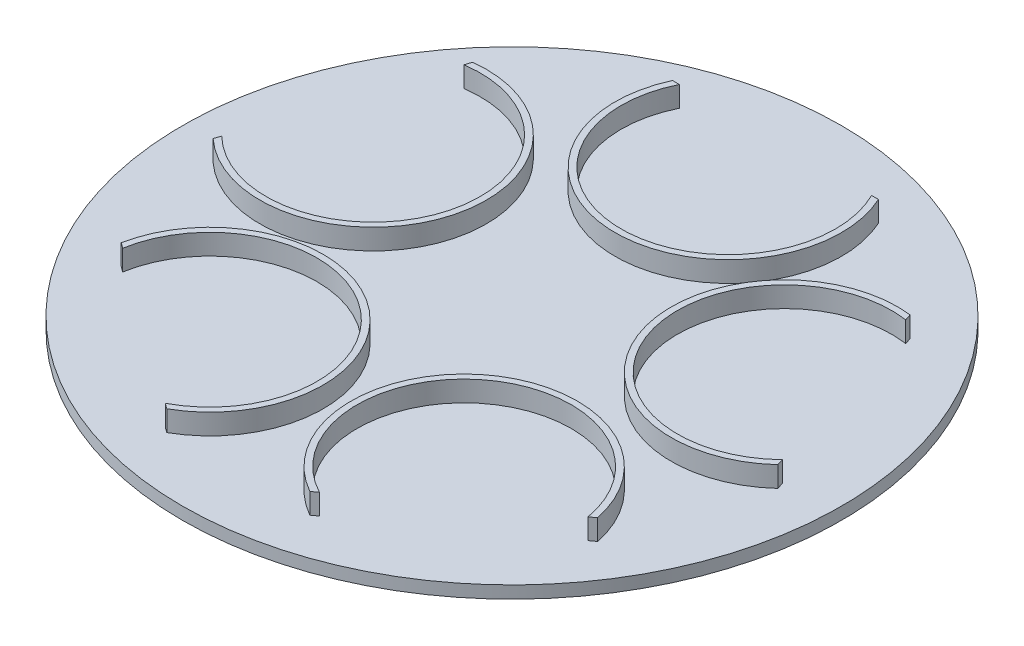
ISO-10303-21;
HEADER;
FILE_DESCRIPTION(('STEP AP214'),'2;1');
FILE_NAME('part.step','',(''),(''),'','','');
FILE_SCHEMA(('AUTOMOTIVE_DESIGN { 1 0 10303 214 1 1 1 1 }'));
ENDSEC;
DATA;
#1=APPLICATION_CONTEXT('core data for automotive mechanical design processes');
#2=APPLICATION_PROTOCOL_DEFINITION('international standard','automotive_design',2000,#1);
#3=PRODUCT_CONTEXT('',#1,'mechanical');
#4=PRODUCT('Part','Part','',(#3));
#5=PRODUCT_RELATED_PRODUCT_CATEGORY('part','',(#4));
#6=PRODUCT_DEFINITION_FORMATION('','',#4);
#7=PRODUCT_DEFINITION_CONTEXT('part definition',#1,'design');
#8=PRODUCT_DEFINITION('design','',#6,#7);
#9=PRODUCT_DEFINITION_SHAPE('','',#8);
#10=(LENGTH_UNIT() NAMED_UNIT(*) SI_UNIT(.MILLI.,.METRE.));
#11=(NAMED_UNIT(*) PLANE_ANGLE_UNIT() SI_UNIT($,.RADIAN.));
#12=(NAMED_UNIT(*) SI_UNIT($,.STERADIAN.) SOLID_ANGLE_UNIT());
#13=UNCERTAINTY_MEASURE_WITH_UNIT(LENGTH_MEASURE(1.E-05),#10,'distance_accuracy_value','');
#14=(GEOMETRIC_REPRESENTATION_CONTEXT(3) GLOBAL_UNCERTAINTY_ASSIGNED_CONTEXT((#13)) GLOBAL_UNIT_ASSIGNED_CONTEXT((#10,
#11,#12)) REPRESENTATION_CONTEXT('',''));
#15=CARTESIAN_POINT('',(0.,0.,0.));
#16=DIRECTION('',(0.,0.,1.));
#17=DIRECTION('',(1.,0.,0.));
#18=AXIS2_PLACEMENT_3D('',#15,#16,#17);
#19=CARTESIAN_POINT('',(0.,3.,0.));
#20=DIRECTION('',(0.,-1.,0.));
#21=DIRECTION('',(0.,0.,-1.));
#22=AXIS2_PLACEMENT_3D('',#19,#20,#21);
#23=CYLINDRICAL_SURFACE('',#22,80.);
#24=CARTESIAN_POINT('',(0.,3.,0.));
#25=DIRECTION('',(0.,1.,0.));
#26=DIRECTION('',(0.,0.,1.));
#27=AXIS2_PLACEMENT_3D('',#24,#25,#26);
#28=CIRCLE('',#27,80.);
#29=CARTESIAN_POINT('',(0.,3.,80.));
#30=VERTEX_POINT('',#29);
#31=EDGE_CURVE('E344',#30,#30,#28,.T.);
#32=ORIENTED_EDGE('',*,*,#31,.F.);
#33=EDGE_LOOP('',(#32));
#34=FACE_BOUND('',#33,.T.);
#35=CARTESIAN_POINT('',(0.,0.,0.));
#36=DIRECTION('',(0.,1.,0.));
#37=DIRECTION('',(0.,0.,1.));
#38=AXIS2_PLACEMENT_3D('',#35,#36,#37);
#39=CIRCLE('',#38,80.);
#40=CARTESIAN_POINT('',(0.,0.,80.));
#41=VERTEX_POINT('',#40);
#42=EDGE_CURVE('E86',#41,#41,#39,.T.);
#43=ORIENTED_EDGE('',*,*,#42,.T.);
#44=EDGE_LOOP('',(#43));
#45=FACE_BOUND('',#44,.T.);
#46=ADVANCED_FACE('F83',(#34,#45),#23,.T.);
#47=CARTESIAN_POINT('',(0.,3.,0.));
#48=DIRECTION('',(0.,1.,0.));
#49=DIRECTION('',(0.,0.,1.));
#50=AXIS2_PLACEMENT_3D('',#47,#48,#49);
#51=PLANE('',#50);
#52=CARTESIAN_POINT('',(0.,3.,-52.5));
#53=DIRECTION('',(0.,1.,0.));
#54=DIRECTION('',(0.,0.,1.));
#55=AXIS2_PLACEMENT_3D('',#52,#53,#54);
#56=CIRCLE('',#55,27.5);
#57=CARTESIAN_POINT('',(-25.,3.,-63.9564392373896));
#58=VERTEX_POINT('',#57);
#59=CARTESIAN_POINT('',(25.,3.,-63.9564392373896));
#60=VERTEX_POINT('',#59);
#61=EDGE_CURVE('E333',#58,#60,#56,.T.);
#62=ORIENTED_EDGE('',*,*,#61,.F.);
#63=DIRECTION('',(1.,0.,0.));
#64=VECTOR('',#63,1.);
#65=CARTESIAN_POINT('',(0.,3.,-63.9564392373896));
#66=LINE('',#65,#64);
#67=CARTESIAN_POINT('',(-23.3398800339676,3.,-63.9564392373896));
#68=VERTEX_POINT('',#67);
#69=EDGE_CURVE('E335',#58,#68,#66,.T.);
#70=ORIENTED_EDGE('',*,*,#69,.T.);
#71=CARTESIAN_POINT('',(0.,3.,-52.5));
#72=DIRECTION('',(0.,1.,0.));
#73=DIRECTION('',(0.,0.,1.));
#74=AXIS2_PLACEMENT_3D('',#71,#72,#73);
#75=CIRCLE('',#74,26.);
#76=CARTESIAN_POINT('',(23.3398800339676,3.,-63.9564392373896));
#77=VERTEX_POINT('',#76);
#78=EDGE_CURVE('E338',#68,#77,#75,.T.);
#79=ORIENTED_EDGE('',*,*,#78,.T.);
#80=DIRECTION('',(1.,0.,0.));
#81=VECTOR('',#80,1.);
#82=CARTESIAN_POINT('',(0.,3.,-63.9564392373896));
#83=LINE('',#82,#81);
#84=EDGE_CURVE('E341',#77,#60,#83,.T.);
#85=ORIENTED_EDGE('',*,*,#84,.T.);
#86=EDGE_LOOP('',(#62,#70,#79,#85));
#87=FACE_BOUND('',#86,.T.);
#88=ORIENTED_EDGE('',*,*,#31,.T.);
#89=EDGE_LOOP('',(#88));
#90=FACE_BOUND('',#89,.T.);
#91=DIRECTION('',(0.309016994374948,0.,0.951056516295154));
#92=VECTOR('',#91,1.);
#93=CARTESIAN_POINT('',(60.8261882957545,3.,-19.7636266240621));
#94=LINE('',#93,#92);
#95=CARTESIAN_POINT('',(53.1007634363809,3.,-43.5400395314408));
#96=VERTEX_POINT('',#95);
#97=CARTESIAN_POINT('',(53.613768718586,3.,-41.961171619914));
#98=VERTEX_POINT('',#97);
#99=EDGE_CURVE('E347',#96,#98,#94,.T.);
#100=ORIENTED_EDGE('',*,*,#99,.T.);
#101=CARTESIAN_POINT('',(49.9304671054956,3.,-16.2233922046846));
#102=DIRECTION('',(0.,1.,0.));
#103=DIRECTION('',(0.,0.,1.));
#104=AXIS2_PLACEMENT_3D('',#101,#102,#103);
#105=CIRCLE('',#104,26.);
#106=CARTESIAN_POINT('',(68.038607872923,3.,2.43391837179016));
#107=VERTEX_POINT('',#106);
#108=EDGE_CURVE('E350',#98,#107,#105,.T.);
#109=ORIENTED_EDGE('',*,*,#108,.T.);
#110=DIRECTION('',(0.309016994374945,0.,0.951056516295155));
#111=VECTOR('',#110,1.);
#112=CARTESIAN_POINT('',(60.8261882957545,3.,-19.7636266240619));
#113=LINE('',#112,#111);
#114=CARTESIAN_POINT('',(68.5516131551281,3.,4.01278628331695));
#115=VERTEX_POINT('',#114);
#116=EDGE_CURVE('E353',#107,#115,#113,.T.);
#117=ORIENTED_EDGE('',*,*,#116,.T.);
#118=CARTESIAN_POINT('',(49.9304671054956,3.,-16.2233922046846));
#119=DIRECTION('',(0.,1.,0.));
#120=DIRECTION('',(0.,0.,1.));
#121=AXIS2_PLACEMENT_3D('',#118,#119,#120);
#122=CIRCLE('',#121,27.5);
#123=EDGE_CURVE('E356',#96,#115,#122,.T.);
#124=ORIENTED_EDGE('',*,*,#123,.F.);
#125=EDGE_LOOP('',(#100,#109,#117,#124));
#126=FACE_BOUND('',#125,.T.);
#127=DIRECTION('',(-0.80901699437495,0.,0.58778525229247));
#128=VECTOR('',#127,1.);
#129=CARTESIAN_POINT('',(37.5926517728771,3.,51.7418462427571));
#130=LINE('',#129,#128);
#131=CARTESIAN_POINT('',(57.8180766322508,3.,37.0472149354454));
#132=VERTEX_POINT('',#131);
#133=CARTESIAN_POINT('',(56.4750113670294,3.,38.0230089685155));
#134=VERTEX_POINT('',#133);
#135=EDGE_CURVE('E226',#132,#134,#130,.T.);
#136=ORIENTED_EDGE('',*,*,#135,.T.);
#137=CARTESIAN_POINT('',(30.8587257453546,3.,42.4733922046849));
#138=DIRECTION('',(0.,1.,0.));
#139=DIRECTION('',(0.,0.,1.));
#140=AXIS2_PLACEMENT_3D('',#137,#138,#139);
#141=CIRCLE('',#140,26.);
#142=CARTESIAN_POINT('',(18.7102921787246,3.,65.4606835169987));
#143=VERTEX_POINT('',#142);
#144=EDGE_CURVE('E359',#134,#143,#141,.T.);
#145=ORIENTED_EDGE('',*,*,#144,.T.);
#146=DIRECTION('',(-0.809016994374951,0.,0.587785252292468));
#147=VECTOR('',#146,1.);
#148=CARTESIAN_POINT('',(37.592651772877,3.,51.7418462427571));
#149=LINE('',#148,#147);
#150=CARTESIAN_POINT('',(17.3672269135032,3.,66.4364775500688));
#151=VERTEX_POINT('',#150);
#152=EDGE_CURVE('E362',#143,#151,#149,.T.);
#153=ORIENTED_EDGE('',*,*,#152,.T.);
#154=CARTESIAN_POINT('',(30.8587257453546,3.,42.4733922046849));
#155=DIRECTION('',(0.,1.,0.));
#156=DIRECTION('',(0.,0.,1.));
#157=AXIS2_PLACEMENT_3D('',#154,#155,#156);
#158=CIRCLE('',#157,27.5);
#159=EDGE_CURVE('E365',#132,#151,#158,.T.);
#160=ORIENTED_EDGE('',*,*,#159,.F.);
#161=EDGE_LOOP('',(#136,#145,#153,#160));
#162=FACE_BOUND('',#161,.T.);
#163=DIRECTION('',(0.309016994374952,0.,-0.951056516295152));
#164=VECTOR('',#163,1.);
#165=CARTESIAN_POINT('',(-60.8261882957545,3.,-19.7636266240624));
#166=LINE('',#165,#164);
#167=CARTESIAN_POINT('',(-68.5516131551282,3.,4.01278628331597));
#168=VERTEX_POINT('',#167);
#169=CARTESIAN_POINT('',(-68.038607872923,3.,2.43391837178919));
#170=VERTEX_POINT('',#169);
#171=EDGE_CURVE('E367',#168,#170,#166,.T.);
#172=ORIENTED_EDGE('',*,*,#171,.T.);
#173=CARTESIAN_POINT('',(-49.9304671054954,3.,-16.2233922046853));
#174=DIRECTION('',(0.,1.,0.));
#175=DIRECTION('',(0.,0.,1.));
#176=AXIS2_PLACEMENT_3D('',#173,#174,#175);
#177=CIRCLE('',#176,26.);
#178=CARTESIAN_POINT('',(-53.6137687185854,3.,-41.9611716199148));
#179=VERTEX_POINT('',#178);
#180=EDGE_CURVE('E370',#170,#179,#177,.T.);
#181=ORIENTED_EDGE('',*,*,#180,.T.);
#182=DIRECTION('',(0.309016994374962,0.,-0.951056516295149));
#183=VECTOR('',#182,1.);
#184=CARTESIAN_POINT('',(-60.8261882957542,3.,-19.763626624063));
#185=LINE('',#184,#183);
#186=CARTESIAN_POINT('',(-53.1007634363802,3.,-43.5400395314415));
#187=VERTEX_POINT('',#186);
#188=EDGE_CURVE('E373',#179,#187,#185,.T.);
#189=ORIENTED_EDGE('',*,*,#188,.T.);
#190=CARTESIAN_POINT('',(-49.9304671054954,3.,-16.2233922046853));
#191=DIRECTION('',(0.,1.,0.));
#192=DIRECTION('',(0.,0.,1.));
#193=AXIS2_PLACEMENT_3D('',#190,#191,#192);
#194=CIRCLE('',#193,27.5);
#195=EDGE_CURVE('E376',#168,#187,#194,.T.);
#196=ORIENTED_EDGE('',*,*,#195,.F.);
#197=EDGE_LOOP('',(#172,#181,#189,#196));
#198=FACE_BOUND('',#197,.T.);
#199=DIRECTION('',(-0.809016994374945,0.,-0.587785252292476));
#200=VECTOR('',#199,1.);
#201=CARTESIAN_POINT('',(-37.5926517728775,3.,51.7418462427568));
#202=LINE('',#201,#200);
#203=CARTESIAN_POINT('',(-17.3672269135042,3.,66.4364775500685));
#204=VERTEX_POINT('',#203);
#205=CARTESIAN_POINT('',(-18.7102921787255,3.,65.4606835169984));
#206=VERTEX_POINT('',#205);
#207=EDGE_CURVE('E378',#204,#206,#202,.T.);
#208=ORIENTED_EDGE('',*,*,#207,.T.);
#209=CARTESIAN_POINT('',(-30.8587257453552,3.,42.4733922046845));
#210=DIRECTION('',(0.,1.,0.));
#211=DIRECTION('',(0.,0.,1.));
#212=AXIS2_PLACEMENT_3D('',#209,#210,#211);
#213=CIRCLE('',#212,26.);
#214=CARTESIAN_POINT('',(-56.4750113670299,3.,38.0230089685147));
#215=VERTEX_POINT('',#214);
#216=EDGE_CURVE('E381',#206,#215,#213,.T.);
#217=ORIENTED_EDGE('',*,*,#216,.T.);
#218=DIRECTION('',(-0.809016994374942,0.,-0.587785252292481));
#219=VECTOR('',#218,1.);
#220=CARTESIAN_POINT('',(-37.5926517728778,3.,51.7418462427565));
#221=LINE('',#220,#219);
#222=CARTESIAN_POINT('',(-57.8180766322513,3.,37.0472149354445));
#223=VERTEX_POINT('',#222);
#224=EDGE_CURVE('E91',#215,#223,#221,.T.);
#225=ORIENTED_EDGE('',*,*,#224,.T.);
#226=CARTESIAN_POINT('',(-30.8587257453552,3.,42.4733922046845));
#227=DIRECTION('',(0.,1.,0.));
#228=DIRECTION('',(0.,0.,1.));
#229=AXIS2_PLACEMENT_3D('',#226,#227,#228);
#230=CIRCLE('',#229,27.5);
#231=EDGE_CURVE('E12',#204,#223,#230,.T.);
#232=ORIENTED_EDGE('',*,*,#231,.F.);
#233=EDGE_LOOP('',(#208,#217,#225,#232));
#234=FACE_BOUND('',#233,.T.);
#235=ADVANCED_FACE('F387',(#87,#90,#126,#162,#198,#234),#51,.T.);
#236=CARTESIAN_POINT('',(0.,0.,0.));
#237=DIRECTION('',(0.,1.,0.));
#238=DIRECTION('',(0.,0.,1.));
#239=AXIS2_PLACEMENT_3D('',#236,#237,#238);
#240=PLANE('',#239);
#241=ORIENTED_EDGE('',*,*,#42,.F.);
#242=EDGE_LOOP('',(#241));
#243=FACE_BOUND('',#242,.T.);
#244=ADVANCED_FACE('F420',(#243),#240,.F.);
#245=CARTESIAN_POINT('',(-17.3672269135042,8.,66.4364775500685));
#246=DIRECTION('',(-0.587785252292476,0.,0.809016994374945));
#247=DIRECTION('',(0.809016994374945,0.,0.587785252292476));
#248=AXIS2_PLACEMENT_3D('',#245,#246,#247);
#249=PLANE('',#248);
#250=DIRECTION('',(0.,-1.,0.));
#251=VECTOR('',#250,1.);
#252=CARTESIAN_POINT('',(-18.7102921787255,8.,65.4606835169984));
#253=LINE('',#252,#251);
#254=CARTESIAN_POINT('',(-18.7102921787255,8.,65.4606835169984));
#255=VERTEX_POINT('',#254);
#256=EDGE_CURVE('E323',#255,#206,#253,.T.);
#257=ORIENTED_EDGE('',*,*,#256,.T.);
#258=ORIENTED_EDGE('',*,*,#207,.F.);
#259=DIRECTION('',(0.,-1.,0.));
#260=VECTOR('',#259,1.);
#261=CARTESIAN_POINT('',(-17.3672269135042,8.,66.4364775500685));
#262=LINE('',#261,#260);
#263=CARTESIAN_POINT('',(-17.3672269135042,8.,66.4364775500685));
#264=VERTEX_POINT('',#263);
#265=EDGE_CURVE('E324',#264,#204,#262,.T.);
#266=ORIENTED_EDGE('',*,*,#265,.F.);
#267=DIRECTION('',(-0.809016994374945,0.,-0.587785252292476));
#268=VECTOR('',#267,1.);
#269=CARTESIAN_POINT('',(-17.3672269135042,8.,66.4364775500685));
#270=LINE('',#269,#268);
#271=EDGE_CURVE('E313',#264,#255,#270,.T.);
#272=ORIENTED_EDGE('',*,*,#271,.T.);
#273=EDGE_LOOP('',(#257,#258,#266,#272));
#274=FACE_BOUND('',#273,.T.);
#275=ADVANCED_FACE('F397',(#274),#249,.T.);
#276=CARTESIAN_POINT('',(-30.8587257453552,8.,42.4733922046845));
#277=DIRECTION('',(0.,-1.,0.));
#278=DIRECTION('',(0.,0.,-1.));
#279=AXIS2_PLACEMENT_3D('',#276,#277,#278);
#280=CYLINDRICAL_SURFACE('',#279,27.5);
#281=ORIENTED_EDGE('',*,*,#231,.T.);
#282=DIRECTION('',(0.,-1.,0.));
#283=VECTOR('',#282,1.);
#284=CARTESIAN_POINT('',(-57.8180766322513,8.,37.0472149354445));
#285=LINE('',#284,#283);
#286=CARTESIAN_POINT('',(-57.8180766322513,8.,37.0472149354445));
#287=VERTEX_POINT('',#286);
#288=EDGE_CURVE('E327',#287,#223,#285,.T.);
#289=ORIENTED_EDGE('',*,*,#288,.F.);
#290=CARTESIAN_POINT('',(-30.8587257453552,8.,42.4733922046845));
#291=DIRECTION('',(0.,1.,0.));
#292=DIRECTION('',(0.,0.,1.));
#293=AXIS2_PLACEMENT_3D('',#290,#291,#292);
#294=CIRCLE('',#293,27.5);
#295=EDGE_CURVE('E321',#264,#287,#294,.T.);
#296=ORIENTED_EDGE('',*,*,#295,.F.);
#297=ORIENTED_EDGE('',*,*,#265,.T.);
#298=EDGE_LOOP('',(#281,#289,#296,#297));
#299=FACE_BOUND('',#298,.T.);
#300=ADVANCED_FACE('F394',(#299),#280,.T.);
#301=CARTESIAN_POINT('',(-56.4750113670299,8.,38.0230089685147));
#302=DIRECTION('',(-0.587785252292481,0.,0.809016994374942));
#303=DIRECTION('',(0.809016994374942,0.,0.587785252292481));
#304=AXIS2_PLACEMENT_3D('',#301,#302,#303);
#305=PLANE('',#304);
#306=ORIENTED_EDGE('',*,*,#288,.T.);
#307=ORIENTED_EDGE('',*,*,#224,.F.);
#308=DIRECTION('',(0.,-1.,0.));
#309=VECTOR('',#308,1.);
#310=CARTESIAN_POINT('',(-56.4750113670299,8.,38.0230089685147));
#311=LINE('',#310,#309);
#312=CARTESIAN_POINT('',(-56.4750113670299,8.,38.0230089685147));
#313=VERTEX_POINT('',#312);
#314=EDGE_CURVE('E98',#313,#215,#311,.T.);
#315=ORIENTED_EDGE('',*,*,#314,.F.);
#316=DIRECTION('',(-0.809016994374942,0.,-0.587785252292481));
#317=VECTOR('',#316,1.);
#318=CARTESIAN_POINT('',(-56.4750113670299,8.,38.0230089685147));
#319=LINE('',#318,#317);
#320=EDGE_CURVE('E318',#313,#287,#319,.T.);
#321=ORIENTED_EDGE('',*,*,#320,.T.);
#322=EDGE_LOOP('',(#306,#307,#315,#321));
#323=FACE_BOUND('',#322,.T.);
#324=ADVANCED_FACE('F389',(#323),#305,.T.);
#325=CARTESIAN_POINT('',(-30.8587257453552,8.,42.4733922046845));
#326=DIRECTION('',(0.,-1.,0.));
#327=DIRECTION('',(0.,0.,-1.));
#328=AXIS2_PLACEMENT_3D('',#325,#326,#327);
#329=CYLINDRICAL_SURFACE('',#328,26.);
#330=ORIENTED_EDGE('',*,*,#314,.T.);
#331=ORIENTED_EDGE('',*,*,#216,.F.);
#332=ORIENTED_EDGE('',*,*,#256,.F.);
#333=CARTESIAN_POINT('',(-30.8587257453552,8.,42.4733922046845));
#334=DIRECTION('',(0.,1.,0.));
#335=DIRECTION('',(0.,0.,1.));
#336=AXIS2_PLACEMENT_3D('',#333,#334,#335);
#337=CIRCLE('',#336,26.);
#338=EDGE_CURVE('E316',#255,#313,#337,.T.);
#339=ORIENTED_EDGE('',*,*,#338,.T.);
#340=EDGE_LOOP('',(#330,#331,#332,#339));
#341=FACE_BOUND('',#340,.T.);
#342=ADVANCED_FACE('F399',(#341),#329,.F.);
#343=CARTESIAN_POINT('',(-30.8587257453552,8.,42.4733922046845));
#344=DIRECTION('',(0.,1.,0.));
#345=DIRECTION('',(0.,0.,1.));
#346=AXIS2_PLACEMENT_3D('',#343,#344,#345);
#347=PLANE('',#346);
#348=ORIENTED_EDGE('',*,*,#271,.F.);
#349=ORIENTED_EDGE('',*,*,#295,.T.);
#350=ORIENTED_EDGE('',*,*,#320,.F.);
#351=ORIENTED_EDGE('',*,*,#338,.F.);
#352=EDGE_LOOP('',(#348,#349,#350,#351));
#353=FACE_BOUND('',#352,.T.);
#354=ADVANCED_FACE('F401',(#353),#347,.T.);
#355=CARTESIAN_POINT('',(-68.5516131551281,8.,4.01278628331597));
#356=DIRECTION('',(-0.951056516295152,0.,-0.309016994374952));
#357=DIRECTION('',(-0.309016994374952,0.,0.951056516295152));
#358=AXIS2_PLACEMENT_3D('',#355,#356,#357);
#359=PLANE('',#358);
#360=DIRECTION('',(0.,-1.,0.));
#361=VECTOR('',#360,1.);
#362=CARTESIAN_POINT('',(-68.038607872923,8.,2.43391837178919));
#363=LINE('',#362,#361);
#364=CARTESIAN_POINT('',(-68.038607872923,8.,2.43391837178919));
#365=VERTEX_POINT('',#364);
#366=EDGE_CURVE('E294',#365,#170,#363,.T.);
#367=ORIENTED_EDGE('',*,*,#366,.T.);
#368=ORIENTED_EDGE('',*,*,#171,.F.);
#369=DIRECTION('',(0.,-1.,0.));
#370=VECTOR('',#369,1.);
#371=CARTESIAN_POINT('',(-68.5516131551282,8.,4.01278628331597));
#372=LINE('',#371,#370);
#373=CARTESIAN_POINT('',(-68.5516131551282,8.,4.01278628331597));
#374=VERTEX_POINT('',#373);
#375=EDGE_CURVE('E293',#374,#168,#372,.T.);
#376=ORIENTED_EDGE('',*,*,#375,.F.);
#377=DIRECTION('',(0.309016994374952,0.,-0.951056516295152));
#378=VECTOR('',#377,1.);
#379=CARTESIAN_POINT('',(-68.5516131551281,8.,4.01278628331597));
#380=LINE('',#379,#378);
#381=EDGE_CURVE('E310',#374,#365,#380,.T.);
#382=ORIENTED_EDGE('',*,*,#381,.T.);
#383=EDGE_LOOP('',(#367,#368,#376,#382));
#384=FACE_BOUND('',#383,.T.);
#385=ADVANCED_FACE('F403',(#384),#359,.T.);
#386=CARTESIAN_POINT('',(-49.9304671054954,8.,-16.2233922046853));
#387=DIRECTION('',(0.,-1.,0.));
#388=DIRECTION('',(0.,0.,-1.));
#389=AXIS2_PLACEMENT_3D('',#386,#387,#388);
#390=CYLINDRICAL_SURFACE('',#389,27.5);
#391=ORIENTED_EDGE('',*,*,#195,.T.);
#392=DIRECTION('',(0.,-1.,0.));
#393=VECTOR('',#392,1.);
#394=CARTESIAN_POINT('',(-53.1007634363802,8.,-43.5400395314415));
#395=LINE('',#394,#393);
#396=CARTESIAN_POINT('',(-53.1007634363802,8.,-43.5400395314415));
#397=VERTEX_POINT('',#396);
#398=EDGE_CURVE('E299',#397,#187,#395,.T.);
#399=ORIENTED_EDGE('',*,*,#398,.F.);
#400=CARTESIAN_POINT('',(-49.9304671054954,8.,-16.2233922046853));
#401=DIRECTION('',(0.,1.,0.));
#402=DIRECTION('',(0.,0.,1.));
#403=AXIS2_PLACEMENT_3D('',#400,#401,#402);
#404=CIRCLE('',#403,27.5);
#405=EDGE_CURVE('E297',#374,#397,#404,.T.);
#406=ORIENTED_EDGE('',*,*,#405,.F.);
#407=ORIENTED_EDGE('',*,*,#375,.T.);
#408=EDGE_LOOP('',(#391,#399,#406,#407));
#409=FACE_BOUND('',#408,.T.);
#410=ADVANCED_FACE('F409',(#409),#390,.T.);
#411=CARTESIAN_POINT('',(-53.6137687185854,8.,-41.9611716199148));
#412=DIRECTION('',(-0.951056516295149,0.,-0.309016994374962));
#413=DIRECTION('',(-0.309016994374962,0.,0.951056516295149));
#414=AXIS2_PLACEMENT_3D('',#411,#412,#413);
#415=PLANE('',#414);
#416=ORIENTED_EDGE('',*,*,#398,.T.);
#417=ORIENTED_EDGE('',*,*,#188,.F.);
#418=DIRECTION('',(0.,-1.,0.));
#419=VECTOR('',#418,1.);
#420=CARTESIAN_POINT('',(-53.6137687185854,8.,-41.9611716199148));
#421=LINE('',#420,#419);
#422=CARTESIAN_POINT('',(-53.6137687185854,8.,-41.9611716199148));
#423=VERTEX_POINT('',#422);
#424=EDGE_CURVE('E106',#423,#179,#421,.T.);
#425=ORIENTED_EDGE('',*,*,#424,.F.);
#426=DIRECTION('',(0.309016994374962,0.,-0.951056516295149));
#427=VECTOR('',#426,1.);
#428=CARTESIAN_POINT('',(-53.6137687185854,8.,-41.9611716199148));
#429=LINE('',#428,#427);
#430=EDGE_CURVE('E305',#423,#397,#429,.T.);
#431=ORIENTED_EDGE('',*,*,#430,.T.);
#432=EDGE_LOOP('',(#416,#417,#425,#431));
#433=FACE_BOUND('',#432,.T.);
#434=ADVANCED_FACE('F467',(#433),#415,.T.);
#435=CARTESIAN_POINT('',(-49.9304671054954,8.,-16.2233922046853));
#436=DIRECTION('',(0.,-1.,0.));
#437=DIRECTION('',(0.,0.,-1.));
#438=AXIS2_PLACEMENT_3D('',#435,#436,#437);
#439=CYLINDRICAL_SURFACE('',#438,26.);
#440=ORIENTED_EDGE('',*,*,#424,.T.);
#441=ORIENTED_EDGE('',*,*,#180,.F.);
#442=ORIENTED_EDGE('',*,*,#366,.F.);
#443=CARTESIAN_POINT('',(-49.9304671054954,8.,-16.2233922046853));
#444=DIRECTION('',(0.,1.,0.));
#445=DIRECTION('',(0.,0.,1.));
#446=AXIS2_PLACEMENT_3D('',#443,#444,#445);
#447=CIRCLE('',#446,26.);
#448=EDGE_CURVE('E308',#365,#423,#447,.T.);
#449=ORIENTED_EDGE('',*,*,#448,.T.);
#450=EDGE_LOOP('',(#440,#441,#442,#449));
#451=FACE_BOUND('',#450,.T.);
#452=ADVANCED_FACE('F477',(#451),#439,.F.);
#453=CARTESIAN_POINT('',(-49.9304671054954,8.,-16.2233922046853));
#454=DIRECTION('',(0.,1.,0.));
#455=DIRECTION('',(0.,0.,1.));
#456=AXIS2_PLACEMENT_3D('',#453,#454,#455);
#457=PLANE('',#456);
#458=ORIENTED_EDGE('',*,*,#381,.F.);
#459=ORIENTED_EDGE('',*,*,#405,.T.);
#460=ORIENTED_EDGE('',*,*,#430,.F.);
#461=ORIENTED_EDGE('',*,*,#448,.F.);
#462=EDGE_LOOP('',(#458,#459,#460,#461));
#463=FACE_BOUND('',#462,.T.);
#464=ADVANCED_FACE('F487',(#463),#457,.T.);
#465=CARTESIAN_POINT('',(-25.,8.,-63.9564392373896));
#466=DIRECTION('',(0.,0.,-1.));
#467=DIRECTION('',(-1.,0.,0.));
#468=AXIS2_PLACEMENT_3D('',#465,#466,#467);
#469=PLANE('',#468);
#470=DIRECTION('',(0.,-1.,0.));
#471=VECTOR('',#470,1.);
#472=CARTESIAN_POINT('',(-23.3398800339676,8.,-63.9564392373896));
#473=LINE('',#472,#471);
#474=CARTESIAN_POINT('',(-23.3398800339676,8.,-63.9564392373896));
#475=VERTEX_POINT('',#474);
#476=EDGE_CURVE('E272',#475,#68,#473,.T.);
#477=ORIENTED_EDGE('',*,*,#476,.T.);
#478=ORIENTED_EDGE('',*,*,#69,.F.);
#479=DIRECTION('',(0.,-1.,0.));
#480=VECTOR('',#479,1.);
#481=CARTESIAN_POINT('',(-25.,8.,-63.9564392373896));
#482=LINE('',#481,#480);
#483=CARTESIAN_POINT('',(-25.,8.,-63.9564392373896));
#484=VERTEX_POINT('',#483);
#485=EDGE_CURVE('E271',#484,#58,#482,.T.);
#486=ORIENTED_EDGE('',*,*,#485,.F.);
#487=DIRECTION('',(1.,0.,0.));
#488=VECTOR('',#487,1.);
#489=CARTESIAN_POINT('',(-25.,8.,-63.9564392373896));
#490=LINE('',#489,#488);
#491=EDGE_CURVE('E290',#484,#475,#490,.T.);
#492=ORIENTED_EDGE('',*,*,#491,.T.);
#493=EDGE_LOOP('',(#477,#478,#486,#492));
#494=FACE_BOUND('',#493,.T.);
#495=ADVANCED_FACE('F496',(#494),#469,.T.);
#496=CARTESIAN_POINT('',(0.,8.,-52.5));
#497=DIRECTION('',(0.,-1.,0.));
#498=DIRECTION('',(0.,0.,-1.));
#499=AXIS2_PLACEMENT_3D('',#496,#497,#498);
#500=CYLINDRICAL_SURFACE('',#499,27.5);
#501=ORIENTED_EDGE('',*,*,#61,.T.);
#502=DIRECTION('',(0.,-1.,0.));
#503=VECTOR('',#502,1.);
#504=CARTESIAN_POINT('',(25.,8.,-63.9564392373896));
#505=LINE('',#504,#503);
#506=CARTESIAN_POINT('',(25.,8.,-63.9564392373896));
#507=VERTEX_POINT('',#506);
#508=EDGE_CURVE('E278',#507,#60,#505,.T.);
#509=ORIENTED_EDGE('',*,*,#508,.F.);
#510=CARTESIAN_POINT('',(0.,8.,-52.5));
#511=DIRECTION('',(0.,1.,0.));
#512=DIRECTION('',(0.,0.,1.));
#513=AXIS2_PLACEMENT_3D('',#510,#511,#512);
#514=CIRCLE('',#513,27.5);
#515=EDGE_CURVE('E275',#484,#507,#514,.T.);
#516=ORIENTED_EDGE('',*,*,#515,.F.);
#517=ORIENTED_EDGE('',*,*,#485,.T.);
#518=EDGE_LOOP('',(#501,#509,#516,#517));
#519=FACE_BOUND('',#518,.T.);
#520=ADVANCED_FACE('F505',(#519),#500,.T.);
#521=CARTESIAN_POINT('',(23.3398800339676,8.,-63.9564392373896));
#522=DIRECTION('',(0.,0.,-1.));
#523=DIRECTION('',(-1.,0.,0.));
#524=AXIS2_PLACEMENT_3D('',#521,#522,#523);
#525=PLANE('',#524);
#526=ORIENTED_EDGE('',*,*,#508,.T.);
#527=ORIENTED_EDGE('',*,*,#84,.F.);
#528=DIRECTION('',(0.,-1.,0.));
#529=VECTOR('',#528,1.);
#530=CARTESIAN_POINT('',(23.3398800339676,8.,-63.9564392373896));
#531=LINE('',#530,#529);
#532=CARTESIAN_POINT('',(23.3398800339676,8.,-63.9564392373896));
#533=VERTEX_POINT('',#532);
#534=EDGE_CURVE('E276',#533,#77,#531,.T.);
#535=ORIENTED_EDGE('',*,*,#534,.F.);
#536=DIRECTION('',(1.,0.,0.));
#537=VECTOR('',#536,1.);
#538=CARTESIAN_POINT('',(23.3398800339676,8.,-63.9564392373896));
#539=LINE('',#538,#537);
#540=EDGE_CURVE('E284',#533,#507,#539,.T.);
#541=ORIENTED_EDGE('',*,*,#540,.T.);
#542=EDGE_LOOP('',(#526,#527,#535,#541));
#543=FACE_BOUND('',#542,.T.);
#544=ADVANCED_FACE('F515',(#543),#525,.T.);
#545=CARTESIAN_POINT('',(0.,8.,-52.5));
#546=DIRECTION('',(0.,-1.,0.));
#547=DIRECTION('',(0.,0.,-1.));
#548=AXIS2_PLACEMENT_3D('',#545,#546,#547);
#549=CYLINDRICAL_SURFACE('',#548,26.);
#550=ORIENTED_EDGE('',*,*,#534,.T.);
#551=ORIENTED_EDGE('',*,*,#78,.F.);
#552=ORIENTED_EDGE('',*,*,#476,.F.);
#553=CARTESIAN_POINT('',(0.,8.,-52.5));
#554=DIRECTION('',(0.,1.,0.));
#555=DIRECTION('',(0.,0.,1.));
#556=AXIS2_PLACEMENT_3D('',#553,#554,#555);
#557=CIRCLE('',#556,26.);
#558=EDGE_CURVE('E287',#475,#533,#557,.T.);
#559=ORIENTED_EDGE('',*,*,#558,.T.);
#560=EDGE_LOOP('',(#550,#551,#552,#559));
#561=FACE_BOUND('',#560,.T.);
#562=ADVANCED_FACE('F525',(#561),#549,.F.);
#563=CARTESIAN_POINT('',(0.,8.,-52.5));
#564=DIRECTION('',(0.,1.,0.));
#565=DIRECTION('',(0.,0.,1.));
#566=AXIS2_PLACEMENT_3D('',#563,#564,#565);
#567=PLANE('',#566);
#568=ORIENTED_EDGE('',*,*,#491,.F.);
#569=ORIENTED_EDGE('',*,*,#515,.T.);
#570=ORIENTED_EDGE('',*,*,#540,.F.);
#571=ORIENTED_EDGE('',*,*,#558,.F.);
#572=EDGE_LOOP('',(#568,#569,#570,#571));
#573=FACE_BOUND('',#572,.T.);
#574=ADVANCED_FACE('F535',(#573),#567,.T.);
#575=CARTESIAN_POINT('',(53.1007634363809,8.,-43.5400395314408));
#576=DIRECTION('',(0.951056516295154,0.,-0.309016994374948));
#577=DIRECTION('',(-0.309016994374948,0.,-0.951056516295154));
#578=AXIS2_PLACEMENT_3D('',#575,#576,#577);
#579=PLANE('',#578);
#580=DIRECTION('',(0.,-1.,0.));
#581=VECTOR('',#580,1.);
#582=CARTESIAN_POINT('',(53.613768718586,8.,-41.961171619914));
#583=LINE('',#582,#581);
#584=CARTESIAN_POINT('',(53.613768718586,8.,-41.961171619914));
#585=VERTEX_POINT('',#584);
#586=EDGE_CURVE('E253',#585,#98,#583,.T.);
#587=ORIENTED_EDGE('',*,*,#586,.T.);
#588=ORIENTED_EDGE('',*,*,#99,.F.);
#589=DIRECTION('',(0.,-1.,0.));
#590=VECTOR('',#589,1.);
#591=CARTESIAN_POINT('',(53.1007634363809,8.,-43.5400395314408));
#592=LINE('',#591,#590);
#593=CARTESIAN_POINT('',(53.1007634363809,8.,-43.5400395314408));
#594=VERTEX_POINT('',#593);
#595=EDGE_CURVE('E245',#594,#96,#592,.T.);
#596=ORIENTED_EDGE('',*,*,#595,.F.);
#597=DIRECTION('',(0.309016994374948,0.,0.951056516295153));
#598=VECTOR('',#597,1.);
#599=CARTESIAN_POINT('',(53.1007634363809,8.,-43.5400395314408));
#600=LINE('',#599,#598);
#601=EDGE_CURVE('E268',#594,#585,#600,.T.);
#602=ORIENTED_EDGE('',*,*,#601,.T.);
#603=EDGE_LOOP('',(#587,#588,#596,#602));
#604=FACE_BOUND('',#603,.T.);
#605=ADVANCED_FACE('F545',(#604),#579,.T.);
#606=CARTESIAN_POINT('',(49.9304671054956,8.,-16.2233922046846));
#607=DIRECTION('',(0.,-1.,0.));
#608=DIRECTION('',(0.,0.,-1.));
#609=AXIS2_PLACEMENT_3D('',#606,#607,#608);
#610=CYLINDRICAL_SURFACE('',#609,27.5);
#611=ORIENTED_EDGE('',*,*,#123,.T.);
#612=DIRECTION('',(0.,-1.,0.));
#613=VECTOR('',#612,1.);
#614=CARTESIAN_POINT('',(68.5516131551281,8.,4.01278628331695));
#615=LINE('',#614,#613);
#616=CARTESIAN_POINT('',(68.5516131551281,8.,4.01278628331695));
#617=VERTEX_POINT('',#616);
#618=EDGE_CURVE('E248',#617,#115,#615,.T.);
#619=ORIENTED_EDGE('',*,*,#618,.F.);
#620=CARTESIAN_POINT('',(49.9304671054956,8.,-16.2233922046846));
#621=DIRECTION('',(0.,1.,0.));
#622=DIRECTION('',(0.,0.,1.));
#623=AXIS2_PLACEMENT_3D('',#620,#621,#622);
#624=CIRCLE('',#623,27.5);
#625=EDGE_CURVE('E256',#594,#617,#624,.T.);
#626=ORIENTED_EDGE('',*,*,#625,.F.);
#627=ORIENTED_EDGE('',*,*,#595,.T.);
#628=EDGE_LOOP('',(#611,#619,#626,#627));
#629=FACE_BOUND('',#628,.T.);
#630=ADVANCED_FACE('F555',(#629),#610,.T.);
#631=CARTESIAN_POINT('',(68.038607872923,8.,2.43391837179017));
#632=DIRECTION('',(0.951056516295154,0.,-0.309016994374945));
#633=DIRECTION('',(-0.309016994374945,0.,-0.951056516295155));
#634=AXIS2_PLACEMENT_3D('',#631,#632,#633);
#635=PLANE('',#634);
#636=ORIENTED_EDGE('',*,*,#618,.T.);
#637=ORIENTED_EDGE('',*,*,#116,.F.);
#638=DIRECTION('',(0.,-1.,0.));
#639=VECTOR('',#638,1.);
#640=CARTESIAN_POINT('',(68.038607872923,8.,2.43391837179016));
#641=LINE('',#640,#639);
#642=CARTESIAN_POINT('',(68.038607872923,8.,2.43391837179016));
#643=VERTEX_POINT('',#642);
#644=EDGE_CURVE('E257',#643,#107,#641,.T.);
#645=ORIENTED_EDGE('',*,*,#644,.F.);
#646=DIRECTION('',(0.309016994374945,0.,0.951056516295154));
#647=VECTOR('',#646,1.);
#648=CARTESIAN_POINT('',(68.038607872923,8.,2.43391837179017));
#649=LINE('',#648,#647);
#650=EDGE_CURVE('E262',#643,#617,#649,.T.);
#651=ORIENTED_EDGE('',*,*,#650,.T.);
#652=EDGE_LOOP('',(#636,#637,#645,#651));
#653=FACE_BOUND('',#652,.T.);
#654=ADVANCED_FACE('F565',(#653),#635,.T.);
#655=CARTESIAN_POINT('',(49.9304671054956,8.,-16.2233922046846));
#656=DIRECTION('',(0.,-1.,0.));
#657=DIRECTION('',(0.,0.,-1.));
#658=AXIS2_PLACEMENT_3D('',#655,#656,#657);
#659=CYLINDRICAL_SURFACE('',#658,26.);
#660=ORIENTED_EDGE('',*,*,#644,.T.);
#661=ORIENTED_EDGE('',*,*,#108,.F.);
#662=ORIENTED_EDGE('',*,*,#586,.F.);
#663=CARTESIAN_POINT('',(49.9304671054956,8.,-16.2233922046846));
#664=DIRECTION('',(0.,1.,0.));
#665=DIRECTION('',(0.,0.,1.));
#666=AXIS2_PLACEMENT_3D('',#663,#664,#665);
#667=CIRCLE('',#666,26.);
#668=EDGE_CURVE('E265',#585,#643,#667,.T.);
#669=ORIENTED_EDGE('',*,*,#668,.T.);
#670=EDGE_LOOP('',(#660,#661,#662,#669));
#671=FACE_BOUND('',#670,.T.);
#672=ADVANCED_FACE('F575',(#671),#659,.F.);
#673=CARTESIAN_POINT('',(49.9304671054956,8.,-16.2233922046846));
#674=DIRECTION('',(0.,1.,0.));
#675=DIRECTION('',(0.,0.,1.));
#676=AXIS2_PLACEMENT_3D('',#673,#674,#675);
#677=PLANE('',#676);
#678=ORIENTED_EDGE('',*,*,#601,.F.);
#679=ORIENTED_EDGE('',*,*,#625,.T.);
#680=ORIENTED_EDGE('',*,*,#650,.F.);
#681=ORIENTED_EDGE('',*,*,#668,.F.);
#682=EDGE_LOOP('',(#678,#679,#680,#681));
#683=FACE_BOUND('',#682,.T.);
#684=ADVANCED_FACE('F585',(#683),#677,.T.);
#685=CARTESIAN_POINT('',(57.8180766322508,8.,37.0472149354454));
#686=DIRECTION('',(0.58778525229247,0.,0.80901699437495));
#687=DIRECTION('',(0.80901699437495,0.,-0.58778525229247));
#688=AXIS2_PLACEMENT_3D('',#685,#686,#687);
#689=PLANE('',#688);
#690=DIRECTION('',(0.,-1.,0.));
#691=VECTOR('',#690,1.);
#692=CARTESIAN_POINT('',(56.4750113670294,8.,38.0230089685155));
#693=LINE('',#692,#691);
#694=CARTESIAN_POINT('',(56.4750113670294,8.,38.0230089685155));
#695=VERTEX_POINT('',#694);
#696=EDGE_CURVE('E239',#695,#134,#693,.T.);
#697=ORIENTED_EDGE('',*,*,#696,.T.);
#698=ORIENTED_EDGE('',*,*,#135,.F.);
#699=DIRECTION('',(0.,-1.,0.));
#700=VECTOR('',#699,1.);
#701=CARTESIAN_POINT('',(57.8180766322508,8.,37.0472149354454));
#702=LINE('',#701,#700);
#703=CARTESIAN_POINT('',(57.8180766322508,8.,37.0472149354454));
#704=VERTEX_POINT('',#703);
#705=EDGE_CURVE('E219',#704,#132,#702,.T.);
#706=ORIENTED_EDGE('',*,*,#705,.F.);
#707=DIRECTION('',(-0.80901699437495,0.,0.58778525229247));
#708=VECTOR('',#707,1.);
#709=CARTESIAN_POINT('',(57.8180766322508,8.,37.0472149354454));
#710=LINE('',#709,#708);
#711=EDGE_CURVE('E224',#704,#695,#710,.T.);
#712=ORIENTED_EDGE('',*,*,#711,.T.);
#713=EDGE_LOOP('',(#697,#698,#706,#712));
#714=FACE_BOUND('',#713,.T.);
#715=ADVANCED_FACE('F222',(#714),#689,.T.);
#716=CARTESIAN_POINT('',(30.8587257453546,8.,42.4733922046849));
#717=DIRECTION('',(0.,-1.,0.));
#718=DIRECTION('',(0.,0.,-1.));
#719=AXIS2_PLACEMENT_3D('',#716,#717,#718);
#720=CYLINDRICAL_SURFACE('',#719,27.5);
#721=ORIENTED_EDGE('',*,*,#159,.T.);
#722=DIRECTION('',(0.,-1.,0.));
#723=VECTOR('',#722,1.);
#724=CARTESIAN_POINT('',(17.3672269135032,8.,66.4364775500688));
#725=LINE('',#724,#723);
#726=CARTESIAN_POINT('',(17.3672269135032,8.,66.4364775500688));
#727=VERTEX_POINT('',#726);
#728=EDGE_CURVE('E229',#727,#151,#725,.T.);
#729=ORIENTED_EDGE('',*,*,#728,.F.);
#730=CARTESIAN_POINT('',(30.8587257453546,8.,42.4733922046849));
#731=DIRECTION('',(0.,1.,0.));
#732=DIRECTION('',(0.,0.,1.));
#733=AXIS2_PLACEMENT_3D('',#730,#731,#732);
#734=CIRCLE('',#733,27.5);
#735=EDGE_CURVE('E232',#704,#727,#734,.T.);
#736=ORIENTED_EDGE('',*,*,#735,.F.);
#737=ORIENTED_EDGE('',*,*,#705,.T.);
#738=EDGE_LOOP('',(#721,#729,#736,#737));
#739=FACE_BOUND('',#738,.T.);
#740=ADVANCED_FACE('F233',(#739),#720,.T.);
#741=CARTESIAN_POINT('',(18.7102921787246,8.,65.4606835169987));
#742=DIRECTION('',(0.587785252292468,0.,0.809016994374951));
#743=DIRECTION('',(0.809016994374951,0.,-0.587785252292468));
#744=AXIS2_PLACEMENT_3D('',#741,#742,#743);
#745=PLANE('',#744);
#746=ORIENTED_EDGE('',*,*,#728,.T.);
#747=ORIENTED_EDGE('',*,*,#152,.F.);
#748=DIRECTION('',(0.,-1.,0.));
#749=VECTOR('',#748,1.);
#750=CARTESIAN_POINT('',(18.7102921787246,8.,65.4606835169987));
#751=LINE('',#750,#749);
#752=CARTESIAN_POINT('',(18.7102921787246,8.,65.4606835169987));
#753=VERTEX_POINT('',#752);
#754=EDGE_CURVE('E643',#753,#143,#751,.T.);
#755=ORIENTED_EDGE('',*,*,#754,.F.);
#756=DIRECTION('',(-0.809016994374951,0.,0.587785252292468));
#757=VECTOR('',#756,1.);
#758=CARTESIAN_POINT('',(18.7102921787246,8.,65.4606835169987));
#759=LINE('',#758,#757);
#760=EDGE_CURVE('E238',#753,#727,#759,.T.);
#761=ORIENTED_EDGE('',*,*,#760,.T.);
#762=EDGE_LOOP('',(#746,#747,#755,#761));
#763=FACE_BOUND('',#762,.T.);
#764=ADVANCED_FACE('F612',(#763),#745,.T.);
#765=CARTESIAN_POINT('',(30.8587257453546,8.,42.4733922046849));
#766=DIRECTION('',(0.,-1.,0.));
#767=DIRECTION('',(0.,0.,-1.));
#768=AXIS2_PLACEMENT_3D('',#765,#766,#767);
#769=CYLINDRICAL_SURFACE('',#768,26.);
#770=ORIENTED_EDGE('',*,*,#754,.T.);
#771=ORIENTED_EDGE('',*,*,#144,.F.);
#772=ORIENTED_EDGE('',*,*,#696,.F.);
#773=CARTESIAN_POINT('',(30.8587257453546,8.,42.4733922046849));
#774=DIRECTION('',(0.,1.,0.));
#775=DIRECTION('',(0.,0.,1.));
#776=AXIS2_PLACEMENT_3D('',#773,#774,#775);
#777=CIRCLE('',#776,26.);
#778=EDGE_CURVE('E244',#695,#753,#777,.T.);
#779=ORIENTED_EDGE('',*,*,#778,.T.);
#780=EDGE_LOOP('',(#770,#771,#772,#779));
#781=FACE_BOUND('',#780,.T.);
#782=ADVANCED_FACE('F621',(#781),#769,.F.);
#783=CARTESIAN_POINT('',(30.8587257453546,8.,42.4733922046849));
#784=DIRECTION('',(0.,1.,0.));
#785=DIRECTION('',(0.,0.,1.));
#786=AXIS2_PLACEMENT_3D('',#783,#784,#785);
#787=PLANE('',#786);
#788=ORIENTED_EDGE('',*,*,#711,.F.);
#789=ORIENTED_EDGE('',*,*,#735,.T.);
#790=ORIENTED_EDGE('',*,*,#760,.F.);
#791=ORIENTED_EDGE('',*,*,#778,.F.);
#792=EDGE_LOOP('',(#788,#789,#790,#791));
#793=FACE_BOUND('',#792,.T.);
#794=ADVANCED_FACE('F242',(#793),#787,.T.);
#795=CLOSED_SHELL('',(#46,#235,#244,#275,#300,#324,#342,#354,#385,#410,#434,#452,#464,#495,#520,
#544,#562,#574,#605,#630,#654,#672,#684,#715,#740,#764,#782,#794));
#796=MANIFOLD_SOLID_BREP('B2',#795);
#797=ADVANCED_BREP_SHAPE_REPRESENTATION('',(#18,#796),#14);
#798=SHAPE_DEFINITION_REPRESENTATION(#9,#797);
ENDSEC;
END-ISO-10303-21;
